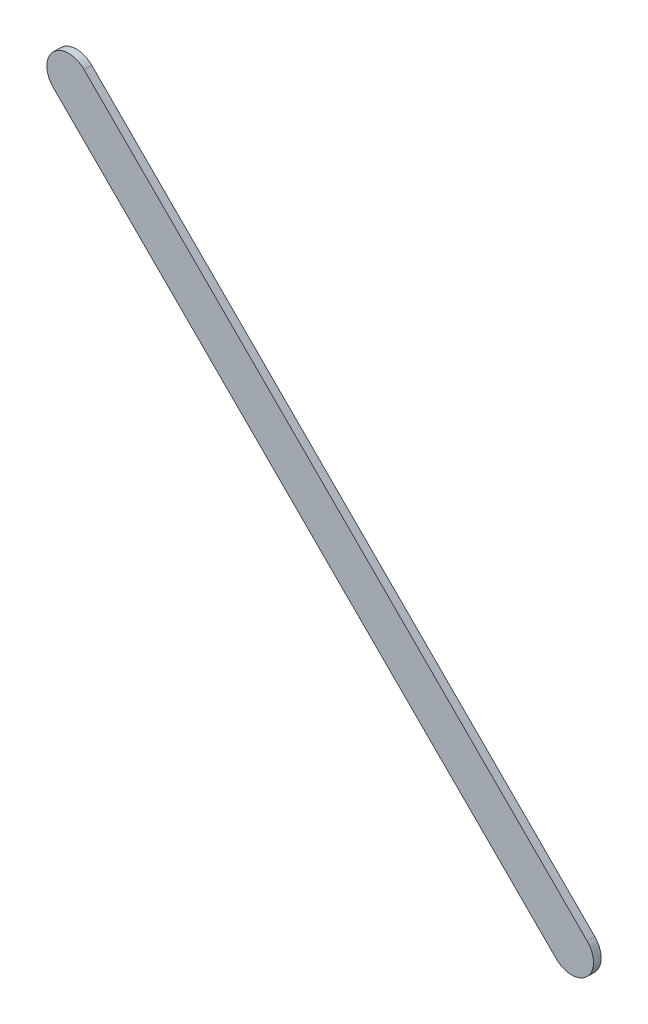
ISO-10303-21;
HEADER;
FILE_DESCRIPTION(('STEP AP214'),'2;1');
FILE_NAME('part.step','',(''),(''),'','','');
FILE_SCHEMA(('AUTOMOTIVE_DESIGN { 1 0 10303 214 1 1 1 1 }'));
ENDSEC;
DATA;
#1=APPLICATION_CONTEXT('core data for automotive mechanical design processes');
#2=APPLICATION_PROTOCOL_DEFINITION('international standard','automotive_design',2000,#1);
#3=PRODUCT_CONTEXT('',#1,'mechanical');
#4=PRODUCT('Part','Part','',(#3));
#5=PRODUCT_RELATED_PRODUCT_CATEGORY('part','',(#4));
#6=PRODUCT_DEFINITION_FORMATION('','',#4);
#7=PRODUCT_DEFINITION_CONTEXT('part definition',#1,'design');
#8=PRODUCT_DEFINITION('design','',#6,#7);
#9=PRODUCT_DEFINITION_SHAPE('','',#8);
#10=(LENGTH_UNIT() NAMED_UNIT(*) SI_UNIT(.MILLI.,.METRE.));
#11=(NAMED_UNIT(*) PLANE_ANGLE_UNIT() SI_UNIT($,.RADIAN.));
#12=(NAMED_UNIT(*) SI_UNIT($,.STERADIAN.) SOLID_ANGLE_UNIT());
#13=UNCERTAINTY_MEASURE_WITH_UNIT(LENGTH_MEASURE(1.E-05),#10,'distance_accuracy_value','');
#14=(GEOMETRIC_REPRESENTATION_CONTEXT(3) GLOBAL_UNCERTAINTY_ASSIGNED_CONTEXT((#13)) GLOBAL_UNIT_ASSIGNED_CONTEXT((#10,
#11,#12)) REPRESENTATION_CONTEXT('',''));
#15=CARTESIAN_POINT('',(0.,0.,0.));
#16=DIRECTION('',(0.,0.,1.));
#17=DIRECTION('',(1.,0.,0.));
#18=AXIS2_PLACEMENT_3D('',#15,#16,#17);
#19=CARTESIAN_POINT('',(101.62071,-126.584975,1.635));
#20=DIRECTION('',(0.,0.,1.));
#21=DIRECTION('',(1.,0.,0.));
#22=AXIS2_PLACEMENT_3D('',#19,#20,#21);
#23=PLANE('',#22);
#24=DIRECTION('',(-0.707106781186548,0.707106781186548,0.));
#25=VECTOR('',#24,1.);
#26=CARTESIAN_POINT('',(101.62071,-126.584975,1.635));
#27=LINE('',#26,#25);
#28=CARTESIAN_POINT('',(101.62071,-126.584975,1.635));
#29=VERTEX_POINT('',#28);
#30=CARTESIAN_POINT('',(99.315024,-124.279289,1.635));
#31=VERTEX_POINT('',#30);
#32=EDGE_CURVE('E82',#29,#31,#27,.T.);
#33=ORIENTED_EDGE('',*,*,#32,.T.);
#34=CARTESIAN_POINT('',(99.2443135,-124.3499995,1.635));
#35=DIRECTION('',(0.,0.,1.));
#36=DIRECTION('',(0.707106781186548,0.707106781186548,0.));
#37=AXIS2_PLACEMENT_3D('',#34,#35,#36);
#38=CIRCLE('',#37,0.09999974810218);
#39=CARTESIAN_POINT('',(99.173603,-124.42071,1.635));
#40=VERTEX_POINT('',#39);
#41=EDGE_CURVE('E104',#31,#40,#38,.T.);
#42=ORIENTED_EDGE('',*,*,#41,.T.);
#43=DIRECTION('',(0.707106781186548,-0.707106781186548,0.));
#44=VECTOR('',#43,1.);
#45=CARTESIAN_POINT('',(99.173603,-124.42071,1.635));
#46=LINE('',#45,#44);
#47=CARTESIAN_POINT('',(101.479289,-126.726396,1.635));
#48=VERTEX_POINT('',#47);
#49=EDGE_CURVE('E74',#40,#48,#46,.T.);
#50=ORIENTED_EDGE('',*,*,#49,.T.);
#51=CARTESIAN_POINT('',(101.5499995,-126.6556855,1.635));
#52=DIRECTION('',(0.,0.,1.));
#53=DIRECTION('',(-0.707106781187048,-0.707106781186048,0.));
#54=AXIS2_PLACEMENT_3D('',#51,#52,#53);
#55=CIRCLE('',#54,0.09999974810218);
#56=EDGE_CURVE('E11',#48,#29,#55,.T.);
#57=ORIENTED_EDGE('',*,*,#56,.T.);
#58=EDGE_LOOP('',(#33,#42,#50,#57));
#59=FACE_BOUND('',#58,.T.);
#60=ADVANCED_FACE('F17',(#59),#23,.T.);
#61=CARTESIAN_POINT('',(101.62071,-126.584975,1.6));
#62=DIRECTION('',(0.,0.,1.));
#63=DIRECTION('',(1.,0.,0.));
#64=AXIS2_PLACEMENT_3D('',#61,#62,#63);
#65=PLANE('',#64);
#66=CARTESIAN_POINT('',(101.5499995,-126.6556855,1.6));
#67=DIRECTION('',(0.,0.,1.));
#68=DIRECTION('',(-0.707106781187048,-0.707106781186048,0.));
#69=AXIS2_PLACEMENT_3D('',#66,#67,#68);
#70=CIRCLE('',#69,0.09999974810218);
#71=CARTESIAN_POINT('',(101.479289,-126.726396,1.6));
#72=VERTEX_POINT('',#71);
#73=CARTESIAN_POINT('',(101.62071,-126.584975,1.6));
#74=VERTEX_POINT('',#73);
#75=EDGE_CURVE('E25',#72,#74,#70,.T.);
#76=ORIENTED_EDGE('',*,*,#75,.F.);
#77=DIRECTION('',(0.707106781186548,-0.707106781186548,0.));
#78=VECTOR('',#77,1.);
#79=CARTESIAN_POINT('',(99.173603,-124.42071,1.6));
#80=LINE('',#79,#78);
#81=CARTESIAN_POINT('',(99.173603,-124.42071,1.6));
#82=VERTEX_POINT('',#81);
#83=EDGE_CURVE('E108',#82,#72,#80,.T.);
#84=ORIENTED_EDGE('',*,*,#83,.F.);
#85=CARTESIAN_POINT('',(99.2443135,-124.3499995,1.6));
#86=DIRECTION('',(0.,0.,1.));
#87=DIRECTION('',(0.707106781186548,0.707106781186548,0.));
#88=AXIS2_PLACEMENT_3D('',#85,#86,#87);
#89=CIRCLE('',#88,0.09999974810218);
#90=CARTESIAN_POINT('',(99.315024,-124.279289,1.6));
#91=VERTEX_POINT('',#90);
#92=EDGE_CURVE('E84',#91,#82,#89,.T.);
#93=ORIENTED_EDGE('',*,*,#92,.F.);
#94=DIRECTION('',(-0.707106781186548,0.707106781186548,0.));
#95=VECTOR('',#94,1.);
#96=CARTESIAN_POINT('',(101.62071,-126.584975,1.6));
#97=LINE('',#96,#95);
#98=EDGE_CURVE('E80',#74,#91,#97,.T.);
#99=ORIENTED_EDGE('',*,*,#98,.F.);
#100=EDGE_LOOP('',(#76,#84,#93,#99));
#101=FACE_BOUND('',#100,.T.);
#102=ADVANCED_FACE('F86',(#101),#65,.F.);
#103=CARTESIAN_POINT('',(101.5499995,-126.6556855,1.6));
#104=DIRECTION('',(0.,0.,-1.));
#105=DIRECTION('',(-0.707106781187048,-0.707106781186048,0.));
#106=AXIS2_PLACEMENT_3D('',#103,#104,#105);
#107=CYLINDRICAL_SURFACE('',#106,0.09999974810218);
#108=ORIENTED_EDGE('',*,*,#75,.T.);
#109=DIRECTION('',(0.,0.,1.));
#110=VECTOR('',#109,1.);
#111=CARTESIAN_POINT('',(101.62071,-126.584975,1.6));
#112=LINE('',#111,#110);
#113=EDGE_CURVE('E68',#74,#29,#112,.T.);
#114=ORIENTED_EDGE('',*,*,#113,.T.);
#115=ORIENTED_EDGE('',*,*,#56,.F.);
#116=DIRECTION('',(0.,0.,1.));
#117=VECTOR('',#116,1.);
#118=CARTESIAN_POINT('',(101.479289,-126.726396,1.6));
#119=LINE('',#118,#117);
#120=EDGE_CURVE('E71',#72,#48,#119,.T.);
#121=ORIENTED_EDGE('',*,*,#120,.F.);
#122=EDGE_LOOP('',(#108,#114,#115,#121));
#123=FACE_BOUND('',#122,.T.);
#124=ADVANCED_FACE('F67',(#123),#107,.T.);
#125=CARTESIAN_POINT('',(99.173603,-124.42071,1.6));
#126=DIRECTION('',(0.707106781186548,0.707106781186548,0.));
#127=DIRECTION('',(0.,0.,-1.));
#128=AXIS2_PLACEMENT_3D('',#125,#126,#127);
#129=PLANE('',#128);
#130=ORIENTED_EDGE('',*,*,#83,.T.);
#131=ORIENTED_EDGE('',*,*,#120,.T.);
#132=ORIENTED_EDGE('',*,*,#49,.F.);
#133=DIRECTION('',(0.,0.,1.));
#134=VECTOR('',#133,1.);
#135=CARTESIAN_POINT('',(99.173603,-124.42071,1.6));
#136=LINE('',#135,#134);
#137=EDGE_CURVE('E103',#82,#40,#136,.T.);
#138=ORIENTED_EDGE('',*,*,#137,.F.);
#139=EDGE_LOOP('',(#130,#131,#132,#138));
#140=FACE_BOUND('',#139,.T.);
#141=ADVANCED_FACE('F122',(#140),#129,.F.);
#142=CARTESIAN_POINT('',(99.2443135,-124.3499995,1.6));
#143=DIRECTION('',(0.,0.,-1.));
#144=DIRECTION('',(0.707106781186548,0.707106781186548,0.));
#145=AXIS2_PLACEMENT_3D('',#142,#143,#144);
#146=CYLINDRICAL_SURFACE('',#145,0.09999974810218);
#147=ORIENTED_EDGE('',*,*,#92,.T.);
#148=ORIENTED_EDGE('',*,*,#137,.T.);
#149=ORIENTED_EDGE('',*,*,#41,.F.);
#150=DIRECTION('',(0.,0.,1.));
#151=VECTOR('',#150,1.);
#152=CARTESIAN_POINT('',(99.315024,-124.279289,1.6));
#153=LINE('',#152,#151);
#154=EDGE_CURVE('E90',#91,#31,#153,.T.);
#155=ORIENTED_EDGE('',*,*,#154,.F.);
#156=EDGE_LOOP('',(#147,#148,#149,#155));
#157=FACE_BOUND('',#156,.T.);
#158=ADVANCED_FACE('F124',(#157),#146,.T.);
#159=CARTESIAN_POINT('',(101.62071,-126.584975,1.6));
#160=DIRECTION('',(-0.707106781186548,-0.707106781186548,0.));
#161=DIRECTION('',(-0.707106781186548,0.707106781186548,0.));
#162=AXIS2_PLACEMENT_3D('',#159,#160,#161);
#163=PLANE('',#162);
#164=ORIENTED_EDGE('',*,*,#98,.T.);
#165=ORIENTED_EDGE('',*,*,#154,.T.);
#166=ORIENTED_EDGE('',*,*,#32,.F.);
#167=ORIENTED_EDGE('',*,*,#113,.F.);
#168=EDGE_LOOP('',(#164,#165,#166,#167));
#169=FACE_BOUND('',#168,.T.);
#170=ADVANCED_FACE('F78',(#169),#163,.F.);
#171=CLOSED_SHELL('',(#60,#102,#124,#141,#158,#170));
#172=MANIFOLD_SOLID_BREP('B1',#171);
#173=ADVANCED_BREP_SHAPE_REPRESENTATION('',(#18,#172),#14);
#174=SHAPE_DEFINITION_REPRESENTATION(#9,#173);
ENDSEC;
END-ISO-10303-21;
